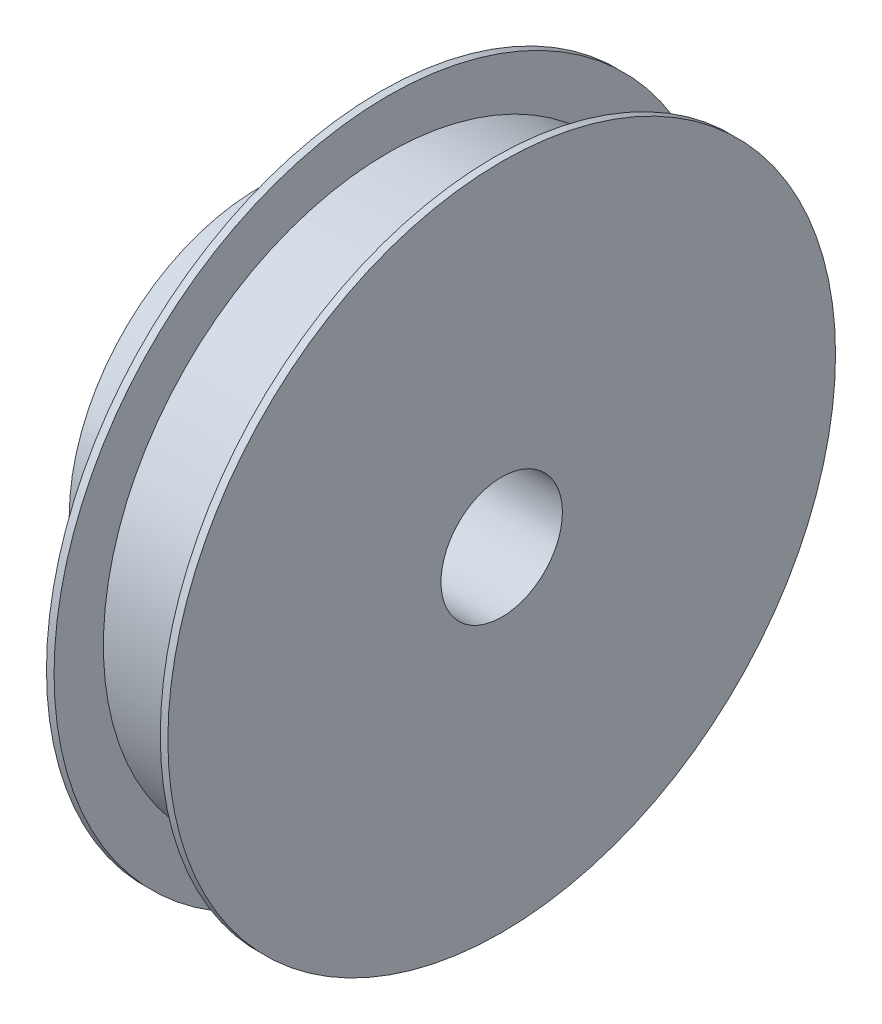
ISO-10303-21;
HEADER;
FILE_DESCRIPTION(('STEP AP214'),'2;1');
FILE_NAME('part.step','',(''),(''),'','','');
FILE_SCHEMA(('AUTOMOTIVE_DESIGN { 1 0 10303 214 1 1 1 1 }'));
ENDSEC;
DATA;
#1=APPLICATION_CONTEXT('core data for automotive mechanical design processes');
#2=APPLICATION_PROTOCOL_DEFINITION('international standard','automotive_design',2000,#1);
#3=PRODUCT_CONTEXT('',#1,'mechanical');
#4=PRODUCT('Part','Part','',(#3));
#5=PRODUCT_RELATED_PRODUCT_CATEGORY('part','',(#4));
#6=PRODUCT_DEFINITION_FORMATION('','',#4);
#7=PRODUCT_DEFINITION_CONTEXT('part definition',#1,'design');
#8=PRODUCT_DEFINITION('design','',#6,#7);
#9=PRODUCT_DEFINITION_SHAPE('','',#8);
#10=(LENGTH_UNIT() NAMED_UNIT(*) SI_UNIT(.MILLI.,.METRE.));
#11=(NAMED_UNIT(*) PLANE_ANGLE_UNIT() SI_UNIT($,.RADIAN.));
#12=(NAMED_UNIT(*) SI_UNIT($,.STERADIAN.) SOLID_ANGLE_UNIT());
#13=UNCERTAINTY_MEASURE_WITH_UNIT(LENGTH_MEASURE(1.E-05),#10,'distance_accuracy_value','');
#14=(GEOMETRIC_REPRESENTATION_CONTEXT(3) GLOBAL_UNCERTAINTY_ASSIGNED_CONTEXT((#13)) GLOBAL_UNIT_ASSIGNED_CONTEXT((#10,
#11,#12)) REPRESENTATION_CONTEXT('',''));
#15=CARTESIAN_POINT('',(0.,0.,0.));
#16=DIRECTION('',(0.,0.,1.));
#17=DIRECTION('',(1.,0.,0.));
#18=AXIS2_PLACEMENT_3D('',#15,#16,#17);
#19=CARTESIAN_POINT('',(35.5000099999999,-249.999999999978,49.9999999999737));
#20=DIRECTION('',(1.,0.,-1.14236496048889E-12));
#21=DIRECTION('',(-1.14236496048889E-12,0.,-1.));
#22=AXIS2_PLACEMENT_3D('',#19,#20,#21);
#23=PLANE('',#22);
#24=CARTESIAN_POINT('',(35.5000099999999,-249.999999999978,49.9999999999737));
#25=DIRECTION('',(1.,0.,-1.14236496048889E-12));
#26=DIRECTION('',(-1.14236496048889E-12,0.,-1.));
#27=AXIS2_PLACEMENT_3D('',#24,#25,#26);
#28=CIRCLE('',#27,12.5);
#29=CARTESIAN_POINT('',(35.5000099999856,-249.999999999978,37.4999999999737));
#30=VERTEX_POINT('',#29);
#31=EDGE_CURVE('E42',#30,#30,#28,.T.);
#32=ORIENTED_EDGE('',*,*,#31,.F.);
#33=EDGE_LOOP('',(#32));
#34=FACE_BOUND('',#33,.T.);
#35=CARTESIAN_POINT('',(35.5000099999999,-249.999999999978,49.9999999999737));
#36=DIRECTION('',(1.,0.,-1.14236496048889E-12));
#37=DIRECTION('',(-1.14236496048889E-12,0.,-1.));
#38=AXIS2_PLACEMENT_3D('',#35,#36,#37);
#39=CIRCLE('',#38,4.00000006311161);
#40=CARTESIAN_POINT('',(35.5000099999953,-249.999999999978,45.9999999368621));
#41=VERTEX_POINT('',#40);
#42=EDGE_CURVE('E47',#41,#41,#39,.T.);
#43=ORIENTED_EDGE('',*,*,#42,.T.);
#44=EDGE_LOOP('',(#43));
#45=FACE_BOUND('',#44,.T.);
#46=ADVANCED_FACE('F31',(#34,#45),#23,.F.);
#47=CARTESIAN_POINT('',(43.5000099999999,-249.999999999978,49.9999999999646));
#48=DIRECTION('',(-1.,0.,1.14236496048889E-12));
#49=DIRECTION('',(1.14236496048889E-12,0.,1.));
#50=AXIS2_PLACEMENT_3D('',#47,#48,#49);
#51=CYLINDRICAL_SURFACE('',#50,12.5);
#52=CARTESIAN_POINT('',(43.5000099999999,-249.999999999978,49.9999999999646));
#53=DIRECTION('',(1.,0.,-1.14236496048889E-12));
#54=DIRECTION('',(-1.14236496048889E-12,0.,-1.));
#55=AXIS2_PLACEMENT_3D('',#52,#53,#54);
#56=CIRCLE('',#55,12.5);
#57=CARTESIAN_POINT('',(43.5000099999856,-249.999999999978,37.4999999999646));
#58=VERTEX_POINT('',#57);
#59=EDGE_CURVE('E38',#58,#58,#56,.T.);
#60=ORIENTED_EDGE('',*,*,#59,.F.);
#61=EDGE_LOOP('',(#60));
#62=FACE_BOUND('',#61,.T.);
#63=ORIENTED_EDGE('',*,*,#31,.T.);
#64=EDGE_LOOP('',(#63));
#65=FACE_BOUND('',#64,.T.);
#66=ADVANCED_FACE('F33',(#62,#65),#51,.T.);
#67=CARTESIAN_POINT('',(43.5000099999999,-249.999999999978,49.9999999999646));
#68=DIRECTION('',(-1.,0.,1.14236496048889E-12));
#69=DIRECTION('',(1.14236496048889E-12,0.,1.));
#70=AXIS2_PLACEMENT_3D('',#67,#68,#69);
#71=CYLINDRICAL_SURFACE('',#70,4.00000006311161);
#72=CARTESIAN_POINT('',(43.5000099999999,-249.999999999978,49.9999999999646));
#73=DIRECTION('',(1.,0.,-1.14236496048889E-12));
#74=DIRECTION('',(-1.14236496048889E-12,0.,-1.));
#75=AXIS2_PLACEMENT_3D('',#72,#73,#74);
#76=CIRCLE('',#75,4.00000006311161);
#77=CARTESIAN_POINT('',(43.5000099999953,-249.999999999978,45.999999936853));
#78=VERTEX_POINT('',#77);
#79=EDGE_CURVE('E51',#78,#78,#76,.T.);
#80=ORIENTED_EDGE('',*,*,#79,.T.);
#81=EDGE_LOOP('',(#80));
#82=FACE_BOUND('',#81,.T.);
#83=ORIENTED_EDGE('',*,*,#42,.F.);
#84=EDGE_LOOP('',(#83));
#85=FACE_BOUND('',#84,.T.);
#86=ADVANCED_FACE('F99',(#82,#85),#71,.F.);
#87=CARTESIAN_POINT('',(43.5000099999999,-249.999999999978,49.9999999999646));
#88=DIRECTION('',(1.,0.,-1.14236496048889E-12));
#89=DIRECTION('',(-1.14236496048889E-12,0.,-1.));
#90=AXIS2_PLACEMENT_3D('',#87,#88,#89);
#91=PLANE('',#90);
#92=ORIENTED_EDGE('',*,*,#79,.F.);
#93=EDGE_LOOP('',(#92));
#94=FACE_BOUND('',#93,.T.);
#95=ADVANCED_FACE('F106',(#94),#91,.F.);
#96=CARTESIAN_POINT('',(44.0000099999999,-249.999999999978,49.999999999964));
#97=DIRECTION('',(-1.,0.,1.14236496048889E-12));
#98=DIRECTION('',(1.14236496048889E-12,0.,1.));
#99=AXIS2_PLACEMENT_3D('',#96,#97,#98);
#100=CYLINDRICAL_SURFACE('',#99,22.);
#101=CARTESIAN_POINT('',(44.0000099999999,-249.999999999978,49.999999999964));
#102=DIRECTION('',(1.,0.,-1.14236496048889E-12));
#103=DIRECTION('',(-1.14236496048889E-12,0.,-1.));
#104=AXIS2_PLACEMENT_3D('',#101,#102,#103);
#105=CIRCLE('',#104,22.);
#106=CARTESIAN_POINT('',(44.0000099999748,-249.999999999978,27.999999999964));
#107=VERTEX_POINT('',#106);
#108=EDGE_CURVE('E54',#107,#107,#105,.T.);
#109=ORIENTED_EDGE('',*,*,#108,.F.);
#110=EDGE_LOOP('',(#109));
#111=FACE_BOUND('',#110,.T.);
#112=CARTESIAN_POINT('',(43.5000099999999,-249.999999999978,49.9999999999646));
#113=DIRECTION('',(1.,0.,-1.14236496048889E-12));
#114=DIRECTION('',(-1.14236496048889E-12,0.,-1.));
#115=AXIS2_PLACEMENT_3D('',#112,#113,#114);
#116=CIRCLE('',#115,22.);
#117=CARTESIAN_POINT('',(43.5000099999748,-249.999999999978,27.9999999999646));
#118=VERTEX_POINT('',#117);
#119=EDGE_CURVE('E55',#118,#118,#116,.T.);
#120=ORIENTED_EDGE('',*,*,#119,.T.);
#121=EDGE_LOOP('',(#120));
#122=FACE_BOUND('',#121,.T.);
#123=ADVANCED_FACE('F108',(#111,#122),#100,.T.);
#124=CARTESIAN_POINT('',(44.0000099999999,-249.999999999978,49.999999999964));
#125=DIRECTION('',(1.,0.,-1.14236496048889E-12));
#126=DIRECTION('',(-1.14236496048889E-12,0.,-1.));
#127=AXIS2_PLACEMENT_3D('',#124,#125,#126);
#128=PLANE('',#127);
#129=CARTESIAN_POINT('',(44.0000099999999,-250.002122473244,49.999999999964));
#130=DIRECTION('',(1.,0.,-1.14236496048889E-12));
#131=DIRECTION('',(-1.14236496048889E-12,0.,-1.));
#132=AXIS2_PLACEMENT_3D('',#129,#130,#131);
#133=CIRCLE('',#132,18.75);
#134=CARTESIAN_POINT('',(44.0000099999785,-250.002122473244,31.249999999964));
#135=VERTEX_POINT('',#134);
#136=EDGE_CURVE('E58',#135,#135,#133,.T.);
#137=ORIENTED_EDGE('',*,*,#136,.F.);
#138=EDGE_LOOP('',(#137));
#139=FACE_BOUND('',#138,.T.);
#140=ORIENTED_EDGE('',*,*,#108,.T.);
#141=EDGE_LOOP('',(#140));
#142=FACE_BOUND('',#141,.T.);
#143=ADVANCED_FACE('F111',(#139,#142),#128,.T.);
#144=ORIENTED_EDGE('',*,*,#59,.T.);
#145=EDGE_LOOP('',(#144));
#146=FACE_BOUND('',#145,.T.);
#147=ORIENTED_EDGE('',*,*,#119,.F.);
#148=EDGE_LOOP('',(#147));
#149=FACE_BOUND('',#148,.T.);
#150=ADVANCED_FACE('F91',(#146,#149),#91,.F.);
#151=CARTESIAN_POINT('',(47.5000099999999,-250.002122473244,49.99999999996));
#152=DIRECTION('',(-1.,0.,1.14236496048889E-12));
#153=DIRECTION('',(1.14236496048889E-12,0.,1.));
#154=AXIS2_PLACEMENT_3D('',#151,#152,#153);
#155=CYLINDRICAL_SURFACE('',#154,18.75);
#156=ORIENTED_EDGE('',*,*,#136,.T.);
#157=EDGE_LOOP('',(#156));
#158=FACE_BOUND('',#157,.T.);
#159=CARTESIAN_POINT('',(51.0000099999999,-250.002122473244,49.999999999956));
#160=DIRECTION('',(1.,0.,-1.14236496048889E-12));
#161=DIRECTION('',(-1.14236496048889E-12,0.,-1.));
#162=AXIS2_PLACEMENT_3D('',#159,#160,#161);
#163=CIRCLE('',#162,18.75);
#164=CARTESIAN_POINT('',(51.0000099999785,-250.002122473244,31.249999999956));
#165=VERTEX_POINT('',#164);
#166=EDGE_CURVE('E63',#165,#165,#163,.T.);
#167=ORIENTED_EDGE('',*,*,#166,.F.);
#168=EDGE_LOOP('',(#167));
#169=FACE_BOUND('',#168,.T.);
#170=ADVANCED_FACE('F81',(#158,#169),#155,.T.);
#171=CARTESIAN_POINT('',(51.5000099999999,-250.002122473244,49.9999999999555));
#172=DIRECTION('',(1.,0.,-1.14236496048889E-12));
#173=DIRECTION('',(-1.14236496048889E-12,0.,-1.));
#174=AXIS2_PLACEMENT_3D('',#171,#172,#173);
#175=PLANE('',#174);
#176=CARTESIAN_POINT('',(51.5000099999999,-250.002122473244,49.9999999999555));
#177=DIRECTION('',(1.,0.,-1.14236496048889E-12));
#178=DIRECTION('',(-1.14236496048889E-12,0.,-1.));
#179=AXIS2_PLACEMENT_3D('',#176,#177,#178);
#180=CIRCLE('',#179,22.);
#181=CARTESIAN_POINT('',(51.5000099999748,-250.002122473244,27.9999999999555));
#182=VERTEX_POINT('',#181);
#183=EDGE_CURVE('E66',#182,#182,#180,.T.);
#184=ORIENTED_EDGE('',*,*,#183,.T.);
#185=EDGE_LOOP('',(#184));
#186=FACE_BOUND('',#185,.T.);
#187=CARTESIAN_POINT('',(51.5000099999999,-250.002122473244,49.9999999999555));
#188=DIRECTION('',(1.,0.,-1.14236496048889E-12));
#189=DIRECTION('',(-1.14236496048889E-12,0.,-1.));
#190=AXIS2_PLACEMENT_3D('',#187,#188,#189);
#191=CIRCLE('',#190,3.9999995);
#192=CARTESIAN_POINT('',(51.5000099999953,-250.002122473244,46.0000004999555));
#193=VERTEX_POINT('',#192);
#194=EDGE_CURVE('E70',#193,#193,#191,.T.);
#195=ORIENTED_EDGE('',*,*,#194,.F.);
#196=EDGE_LOOP('',(#195));
#197=FACE_BOUND('',#196,.T.);
#198=ADVANCED_FACE('F78',(#186,#197),#175,.T.);
#199=CARTESIAN_POINT('',(51.0000099999999,-250.002122473244,49.999999999956));
#200=DIRECTION('',(1.,0.,-1.14236496048889E-12));
#201=DIRECTION('',(-1.14236496048889E-12,0.,-1.));
#202=AXIS2_PLACEMENT_3D('',#199,#200,#201);
#203=PLANE('',#202);
#204=ORIENTED_EDGE('',*,*,#166,.T.);
#205=EDGE_LOOP('',(#204));
#206=FACE_BOUND('',#205,.T.);
#207=CARTESIAN_POINT('',(51.0000099999999,-250.002122473244,49.999999999956));
#208=DIRECTION('',(1.,0.,-1.14236496048889E-12));
#209=DIRECTION('',(-1.14236496048889E-12,0.,-1.));
#210=AXIS2_PLACEMENT_3D('',#207,#208,#209);
#211=CIRCLE('',#210,22.);
#212=CARTESIAN_POINT('',(51.0000099999748,-250.002122473244,27.999999999956));
#213=VERTEX_POINT('',#212);
#214=EDGE_CURVE('E67',#213,#213,#211,.T.);
#215=ORIENTED_EDGE('',*,*,#214,.F.);
#216=EDGE_LOOP('',(#215));
#217=FACE_BOUND('',#216,.T.);
#218=ADVANCED_FACE('F80',(#206,#217),#203,.F.);
#219=CARTESIAN_POINT('',(51.5000099999999,-250.002122473244,49.9999999999555));
#220=DIRECTION('',(-1.,0.,1.14236496048889E-12));
#221=DIRECTION('',(1.14236496048889E-12,0.,1.));
#222=AXIS2_PLACEMENT_3D('',#219,#220,#221);
#223=CYLINDRICAL_SURFACE('',#222,22.);
#224=ORIENTED_EDGE('',*,*,#183,.F.);
#225=EDGE_LOOP('',(#224));
#226=FACE_BOUND('',#225,.T.);
#227=ORIENTED_EDGE('',*,*,#214,.T.);
#228=EDGE_LOOP('',(#227));
#229=FACE_BOUND('',#228,.T.);
#230=ADVANCED_FACE('F88',(#226,#229),#223,.T.);
#231=CARTESIAN_POINT('',(44.0000099999999,-250.002122473244,49.999999999964));
#232=DIRECTION('',(1.,0.,-1.14236496048889E-12));
#233=DIRECTION('',(-1.14236496048889E-12,0.,-1.));
#234=AXIS2_PLACEMENT_3D('',#231,#232,#233);
#235=CIRCLE('',#234,3.9999995);
#236=CARTESIAN_POINT('',(44.0000099999953,-250.002122473244,46.000000499964));
#237=VERTEX_POINT('',#236);
#238=EDGE_CURVE('E10',#237,#237,#235,.F.);
#239=ORIENTED_EDGE('',*,*,#238,.F.);
#240=EDGE_LOOP('',(#239));
#241=FACE_BOUND('',#240,.T.);
#242=ADVANCED_FACE('F117',(#241),#128,.T.);
#243=CARTESIAN_POINT('',(47.5000099999999,-250.002122473244,49.99999999996));
#244=DIRECTION('',(-1.,0.,1.14236496048889E-12));
#245=DIRECTION('',(1.14236496048889E-12,0.,1.));
#246=AXIS2_PLACEMENT_3D('',#243,#244,#245);
#247=CYLINDRICAL_SURFACE('',#246,3.9999995);
#248=ORIENTED_EDGE('',*,*,#238,.T.);
#249=EDGE_LOOP('',(#248));
#250=FACE_BOUND('',#249,.T.);
#251=ORIENTED_EDGE('',*,*,#194,.T.);
#252=EDGE_LOOP('',(#251));
#253=FACE_BOUND('',#252,.T.);
#254=ADVANCED_FACE('F76',(#250,#253),#247,.F.);
#255=CLOSED_SHELL('',(#46,#66,#86,#95,#123,#143,#150,#170,#198,#218,#230,#242,#254));
#256=MANIFOLD_SOLID_BREP('B2',#255);
#257=ADVANCED_BREP_SHAPE_REPRESENTATION('',(#18,#256),#14);
#258=SHAPE_DEFINITION_REPRESENTATION(#9,#257);
ENDSEC;
END-ISO-10303-21;
